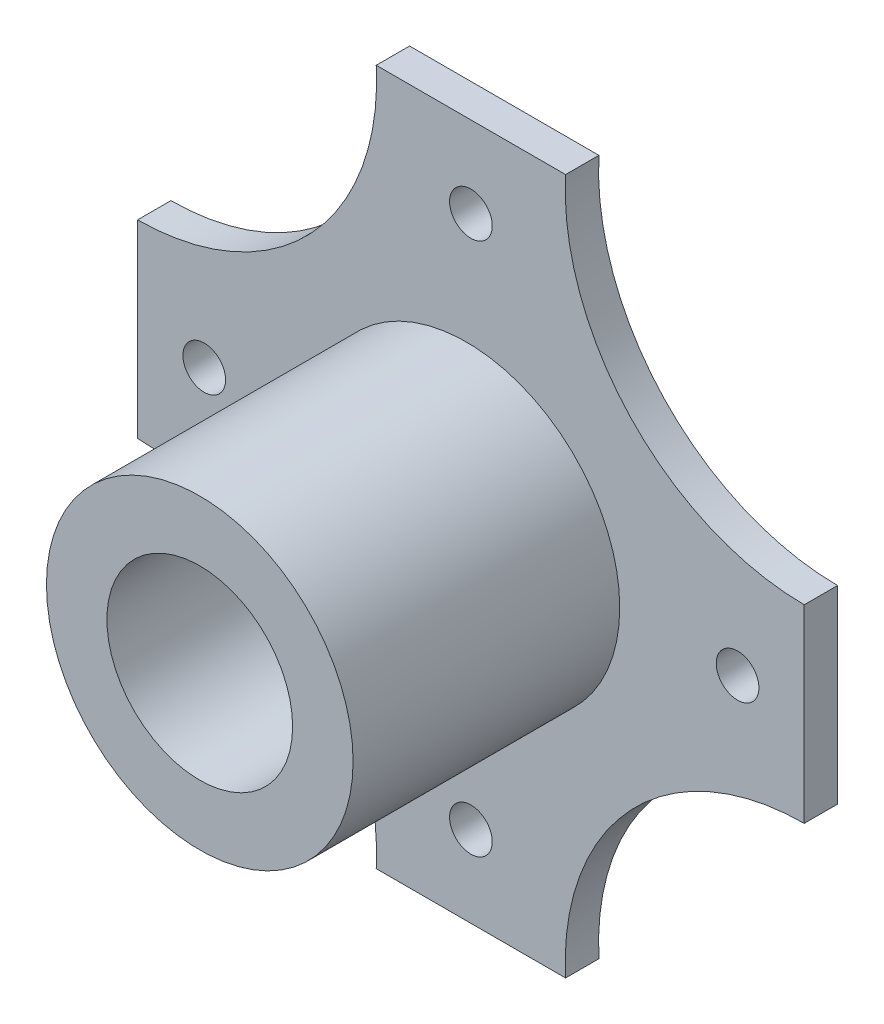
ISO-10303-21;
HEADER;
FILE_DESCRIPTION(('STEP AP214'),'2;1');
FILE_NAME('part.step','',(''),(''),'','','');
FILE_SCHEMA(('AUTOMOTIVE_DESIGN { 1 0 10303 214 1 1 1 1 }'));
ENDSEC;
DATA;
#1=APPLICATION_CONTEXT('core data for automotive mechanical design processes');
#2=APPLICATION_PROTOCOL_DEFINITION('international standard','automotive_design',2000,#1);
#3=PRODUCT_CONTEXT('',#1,'mechanical');
#4=PRODUCT('Part','Part','',(#3));
#5=PRODUCT_RELATED_PRODUCT_CATEGORY('part','',(#4));
#6=PRODUCT_DEFINITION_FORMATION('','',#4);
#7=PRODUCT_DEFINITION_CONTEXT('part definition',#1,'design');
#8=PRODUCT_DEFINITION('design','',#6,#7);
#9=PRODUCT_DEFINITION_SHAPE('','',#8);
#10=(LENGTH_UNIT() NAMED_UNIT(*) SI_UNIT(.MILLI.,.METRE.));
#11=(NAMED_UNIT(*) PLANE_ANGLE_UNIT() SI_UNIT($,.RADIAN.));
#12=(NAMED_UNIT(*) SI_UNIT($,.STERADIAN.) SOLID_ANGLE_UNIT());
#13=UNCERTAINTY_MEASURE_WITH_UNIT(LENGTH_MEASURE(1.E-05),#10,'distance_accuracy_value','');
#14=(GEOMETRIC_REPRESENTATION_CONTEXT(3) GLOBAL_UNCERTAINTY_ASSIGNED_CONTEXT((#13)) GLOBAL_UNIT_ASSIGNED_CONTEXT((#10,
#11,#12)) REPRESENTATION_CONTEXT('',''));
#15=CARTESIAN_POINT('',(0.,0.,0.));
#16=DIRECTION('',(0.,0.,1.));
#17=DIRECTION('',(1.,0.,0.));
#18=AXIS2_PLACEMENT_3D('',#15,#16,#17);
#19=CARTESIAN_POINT('',(31.4151689122494,31.877,0.));
#20=DIRECTION('',(0.,0.,1.));
#21=DIRECTION('',(1.,0.,0.));
#22=AXIS2_PLACEMENT_3D('',#19,#20,#21);
#23=CYLINDRICAL_SURFACE('',#22,5.715);
#24=CARTESIAN_POINT('',(31.4151689122494,31.877,6.35));
#25=DIRECTION('',(0.,0.,-1.));
#26=DIRECTION('',(-1.,0.,0.));
#27=AXIS2_PLACEMENT_3D('',#24,#25,#26);
#28=CIRCLE('',#27,5.715);
#29=CARTESIAN_POINT('',(25.7001689122494,31.877,6.35));
#30=VERTEX_POINT('',#29);
#31=EDGE_CURVE('E181',#30,#30,#28,.F.);
#32=ORIENTED_EDGE('',*,*,#31,.T.);
#33=EDGE_LOOP('',(#32));
#34=FACE_BOUND('',#33,.T.);
#35=CARTESIAN_POINT('',(31.4151689122494,31.877,3.175));
#36=DIRECTION('',(0.,0.,-1.));
#37=DIRECTION('',(-1.,0.,0.));
#38=AXIS2_PLACEMENT_3D('',#35,#36,#37);
#39=CIRCLE('',#38,5.715);
#40=CARTESIAN_POINT('',(25.7001689122494,31.877,3.175));
#41=VERTEX_POINT('',#40);
#42=EDGE_CURVE('E43',#41,#41,#39,.F.);
#43=ORIENTED_EDGE('',*,*,#42,.F.);
#44=EDGE_LOOP('',(#43));
#45=FACE_BOUND('',#44,.T.);
#46=ADVANCED_FACE('F39',(#34,#45),#23,.F.);
#47=CARTESIAN_POINT('',(63.6846705216539,0.,3.175));
#48=DIRECTION('',(0.,0.,-1.));
#49=DIRECTION('',(-1.,0.,0.));
#50=AXIS2_PLACEMENT_3D('',#47,#48,#49);
#51=PLANE('',#50);
#52=CARTESIAN_POINT('',(31.4151689122494,31.877,3.175));
#53=DIRECTION('',(0.,0.,1.));
#54=DIRECTION('',(1.,0.,0.));
#55=AXIS2_PLACEMENT_3D('',#52,#53,#54);
#56=CIRCLE('',#55,14.605);
#57=CARTESIAN_POINT('',(46.0201689122494,31.877,3.175));
#58=VERTEX_POINT('',#57);
#59=EDGE_CURVE('E12',#58,#58,#56,.T.);
#60=ORIENTED_EDGE('',*,*,#59,.F.);
#61=EDGE_LOOP('',(#60));
#62=FACE_BOUND('',#61,.T.);
#63=CARTESIAN_POINT('',(63.6846705216539,0.,3.175));
#64=DIRECTION('',(0.,0.,-1.));
#65=DIRECTION('',(-1.,0.,0.));
#66=AXIS2_PLACEMENT_3D('',#63,#64,#65);
#67=CIRCLE('',#66,22.8600000000001);
#68=CARTESIAN_POINT('',(40.8595217505166,-1.26181756821567,3.175));
#69=VERTEX_POINT('',#68);
#70=CARTESIAN_POINT('',(63.5923326971552,22.8598135103103,3.175));
#71=VERTEX_POINT('',#70);
#72=EDGE_CURVE('E168',#69,#71,#67,.T.);
#73=ORIENTED_EDGE('',*,*,#72,.T.);
#74=DIRECTION('',(0.,1.,0.));
#75=VECTOR('',#74,1.);
#76=CARTESIAN_POINT('',(63.5923326971552,40.8941864896897,3.175));
#77=LINE('',#76,#75);
#78=CARTESIAN_POINT('',(63.5923326971552,40.8941864896896,3.175));
#79=VERTEX_POINT('',#78);
#80=EDGE_CURVE('E107',#71,#79,#77,.T.);
#81=ORIENTED_EDGE('',*,*,#80,.T.);
#82=CARTESIAN_POINT('',(63.6846705216539,63.754,3.175));
#83=DIRECTION('',(0.,0.,-1.));
#84=DIRECTION('',(-1.,0.,0.));
#85=AXIS2_PLACEMENT_3D('',#82,#83,#84);
#86=CIRCLE('',#85,22.8600000000001);
#87=CARTESIAN_POINT('',(40.8595217505166,65.0158175682157,3.175));
#88=VERTEX_POINT('',#87);
#89=EDGE_CURVE('E223',#79,#88,#86,.T.);
#90=ORIENTED_EDGE('',*,*,#89,.T.);
#91=DIRECTION('',(-1.,0.,0.));
#92=VECTOR('',#91,1.);
#93=CARTESIAN_POINT('',(22.8251487711373,65.0158175682157,3.175));
#94=LINE('',#93,#92);
#95=CARTESIAN_POINT('',(22.8251487711371,65.0158175682156,3.175));
#96=VERTEX_POINT('',#95);
#97=EDGE_CURVE('E225',#88,#96,#94,.T.);
#98=ORIENTED_EDGE('',*,*,#97,.T.);
#99=CARTESIAN_POINT('',(0.,63.7539999999999,3.175));
#100=DIRECTION('',(0.,0.,-1.));
#101=DIRECTION('',(-1.,0.,0.));
#102=AXIS2_PLACEMENT_3D('',#99,#100,#101);
#103=CIRCLE('',#102,22.86);
#104=CARTESIAN_POINT('',(0.0923378244987348,40.8941864896897,3.175));
#105=VERTEX_POINT('',#104);
#106=EDGE_CURVE('E131',#96,#105,#103,.T.);
#107=ORIENTED_EDGE('',*,*,#106,.T.);
#108=DIRECTION('',(0.,-1.,0.));
#109=VECTOR('',#108,1.);
#110=CARTESIAN_POINT('',(0.0923378244987348,22.8598135103103,3.175));
#111=LINE('',#110,#109);
#112=CARTESIAN_POINT('',(0.092337824498735,22.8598135103104,3.175));
#113=VERTEX_POINT('',#112);
#114=EDGE_CURVE('E123',#105,#113,#111,.T.);
#115=ORIENTED_EDGE('',*,*,#114,.T.);
#116=CARTESIAN_POINT('',(0.,0.,3.175));
#117=DIRECTION('',(0.,0.,-1.));
#118=DIRECTION('',(1.,0.,0.));
#119=AXIS2_PLACEMENT_3D('',#116,#117,#118);
#120=CIRCLE('',#119,22.8600000000001);
#121=CARTESIAN_POINT('',(22.8251487711373,-1.26181756821567,3.175));
#122=VERTEX_POINT('',#121);
#123=EDGE_CURVE('E128',#113,#122,#120,.T.);
#124=ORIENTED_EDGE('',*,*,#123,.T.);
#125=DIRECTION('',(1.,0.,0.));
#126=VECTOR('',#125,1.);
#127=CARTESIAN_POINT('',(40.8595217505166,-1.26181756821567,3.175));
#128=LINE('',#127,#126);
#129=EDGE_CURVE('E65',#122,#69,#128,.T.);
#130=ORIENTED_EDGE('',*,*,#129,.T.);
#131=EDGE_LOOP('',(#73,#81,#90,#98,#107,#115,#124,#130));
#132=FACE_BOUND('',#131,.T.);
#133=CARTESIAN_POINT('',(6.44233526082695,31.877,3.175));
#134=DIRECTION('',(0.,0.,1.));
#135=DIRECTION('',(1.,0.,0.));
#136=AXIS2_PLACEMENT_3D('',#133,#134,#135);
#137=CIRCLE('',#136,2.03200000000001);
#138=CARTESIAN_POINT('',(8.47433526082696,31.877,3.175));
#139=VERTEX_POINT('',#138);
#140=EDGE_CURVE('E156',#139,#139,#137,.T.);
#141=ORIENTED_EDGE('',*,*,#140,.F.);
#142=EDGE_LOOP('',(#141));
#143=FACE_BOUND('',#142,.T.);
#144=CARTESIAN_POINT('',(31.8423352608269,57.277,3.175));
#145=DIRECTION('',(0.,0.,1.));
#146=DIRECTION('',(1.,0.,0.));
#147=AXIS2_PLACEMENT_3D('',#144,#145,#146);
#148=CIRCLE('',#147,2.032);
#149=CARTESIAN_POINT('',(33.8743352608269,57.277,3.175));
#150=VERTEX_POINT('',#149);
#151=EDGE_CURVE('E211',#150,#150,#148,.T.);
#152=ORIENTED_EDGE('',*,*,#151,.F.);
#153=EDGE_LOOP('',(#152));
#154=FACE_BOUND('',#153,.T.);
#155=CARTESIAN_POINT('',(57.2423352608269,31.8769999999998,3.175));
#156=DIRECTION('',(0.,0.,1.));
#157=DIRECTION('',(1.,0.,0.));
#158=AXIS2_PLACEMENT_3D('',#155,#156,#157);
#159=CIRCLE('',#158,2.03200000000001);
#160=CARTESIAN_POINT('',(59.2743352608269,31.8769999999998,3.175));
#161=VERTEX_POINT('',#160);
#162=EDGE_CURVE('E205',#161,#161,#159,.T.);
#163=ORIENTED_EDGE('',*,*,#162,.F.);
#164=EDGE_LOOP('',(#163));
#165=FACE_BOUND('',#164,.T.);
#166=CARTESIAN_POINT('',(31.8423378244986,6.47700000000015,3.175));
#167=DIRECTION('',(0.,0.,1.));
#168=DIRECTION('',(1.,0.,0.));
#169=AXIS2_PLACEMENT_3D('',#166,#167,#168);
#170=CIRCLE('',#169,2.032);
#171=CARTESIAN_POINT('',(33.8743378244986,6.47700000000015,3.175));
#172=VERTEX_POINT('',#171);
#173=EDGE_CURVE('E199',#172,#172,#170,.T.);
#174=ORIENTED_EDGE('',*,*,#173,.F.);
#175=EDGE_LOOP('',(#174));
#176=FACE_BOUND('',#175,.T.);
#177=ADVANCED_FACE('F125',(#62,#132,#143,#154,#165,#176),#51,.F.);
#178=CARTESIAN_POINT('',(63.6846705216539,0.,0.));
#179=DIRECTION('',(0.,0.,-1.));
#180=DIRECTION('',(-1.,0.,0.));
#181=AXIS2_PLACEMENT_3D('',#178,#179,#180);
#182=PLANE('',#181);
#183=DIRECTION('',(-0.499999999999995,0.866025403784441,0.));
#184=VECTOR('',#183,1.);
#185=CARTESIAN_POINT('',(27.2358310750214,24.6381745239264,0.));
#186=LINE('',#185,#184);
#187=CARTESIAN_POINT('',(27.2358310750214,24.6381745239264,0.));
#188=VERTEX_POINT('',#187);
#189=CARTESIAN_POINT('',(23.0564932377936,31.877,0.));
#190=VERTEX_POINT('',#189);
#191=EDGE_CURVE('E56',#188,#190,#186,.T.);
#192=ORIENTED_EDGE('',*,*,#191,.F.);
#193=DIRECTION('',(-1.,0.,0.));
#194=VECTOR('',#193,1.);
#195=CARTESIAN_POINT('',(35.5945067494772,24.6381745239263,0.));
#196=LINE('',#195,#194);
#197=CARTESIAN_POINT('',(35.5945067494772,24.6381745239263,0.));
#198=VERTEX_POINT('',#197);
#199=EDGE_CURVE('E563',#198,#188,#196,.T.);
#200=ORIENTED_EDGE('',*,*,#199,.F.);
#201=DIRECTION('',(-0.500000000000007,-0.866025403784435,0.));
#202=VECTOR('',#201,1.);
#203=CARTESIAN_POINT('',(39.7738445867051,31.8769999999999,0.));
#204=LINE('',#203,#202);
#205=CARTESIAN_POINT('',(39.7738445867051,31.8769999999999,0.));
#206=VERTEX_POINT('',#205);
#207=EDGE_CURVE('E568',#206,#198,#204,.T.);
#208=ORIENTED_EDGE('',*,*,#207,.F.);
#209=DIRECTION('',(0.499999999999995,-0.866025403784442,0.));
#210=VECTOR('',#209,1.);
#211=CARTESIAN_POINT('',(35.5945067494773,39.1158254760737,0.));
#212=LINE('',#211,#210);
#213=CARTESIAN_POINT('',(35.5945067494773,39.1158254760737,0.));
#214=VERTEX_POINT('',#213);
#215=EDGE_CURVE('E584',#214,#206,#212,.T.);
#216=ORIENTED_EDGE('',*,*,#215,.F.);
#217=DIRECTION('',(1.,0.,0.));
#218=VECTOR('',#217,1.);
#219=CARTESIAN_POINT('',(27.2358310750215,39.1158254760737,0.));
#220=LINE('',#219,#218);
#221=CARTESIAN_POINT('',(27.2358310750215,39.1158254760737,0.));
#222=VERTEX_POINT('',#221);
#223=EDGE_CURVE('E587',#222,#214,#220,.T.);
#224=ORIENTED_EDGE('',*,*,#223,.F.);
#225=DIRECTION('',(0.500000000000001,0.866025403784438,0.));
#226=VECTOR('',#225,1.);
#227=CARTESIAN_POINT('',(23.0564932377936,31.877,0.));
#228=LINE('',#227,#226);
#229=EDGE_CURVE('E590',#190,#222,#228,.T.);
#230=ORIENTED_EDGE('',*,*,#229,.F.);
#231=EDGE_LOOP('',(#192,#200,#208,#216,#224,#230));
#232=FACE_BOUND('',#231,.T.);
#233=CARTESIAN_POINT('',(57.2423352608269,31.8769999999998,0.));
#234=DIRECTION('',(0.,0.,1.));
#235=DIRECTION('',(1.,0.,0.));
#236=AXIS2_PLACEMENT_3D('',#233,#234,#235);
#237=CIRCLE('',#236,2.03200000000001);
#238=CARTESIAN_POINT('',(59.2743352608269,31.8769999999998,0.));
#239=VERTEX_POINT('',#238);
#240=EDGE_CURVE('E202',#239,#239,#237,.T.);
#241=ORIENTED_EDGE('',*,*,#240,.T.);
#242=EDGE_LOOP('',(#241));
#243=FACE_BOUND('',#242,.T.);
#244=CARTESIAN_POINT('',(6.44233526082695,31.877,0.));
#245=DIRECTION('',(0.,0.,1.));
#246=DIRECTION('',(1.,0.,0.));
#247=AXIS2_PLACEMENT_3D('',#244,#245,#246);
#248=CIRCLE('',#247,2.03200000000001);
#249=CARTESIAN_POINT('',(8.47433526082696,31.877,0.));
#250=VERTEX_POINT('',#249);
#251=EDGE_CURVE('E214',#250,#250,#248,.T.);
#252=ORIENTED_EDGE('',*,*,#251,.T.);
#253=EDGE_LOOP('',(#252));
#254=FACE_BOUND('',#253,.T.);
#255=CARTESIAN_POINT('',(63.6846705216539,0.,0.));
#256=DIRECTION('',(0.,0.,-1.));
#257=DIRECTION('',(-1.,0.,0.));
#258=AXIS2_PLACEMENT_3D('',#255,#256,#257);
#259=CIRCLE('',#258,22.8600000000001);
#260=CARTESIAN_POINT('',(40.8595217505166,-1.26181756821567,0.));
#261=VERTEX_POINT('',#260);
#262=CARTESIAN_POINT('',(63.5923326971552,22.8598135103103,0.));
#263=VERTEX_POINT('',#262);
#264=EDGE_CURVE('E152',#261,#263,#259,.T.);
#265=ORIENTED_EDGE('',*,*,#264,.F.);
#266=DIRECTION('',(1.,0.,0.));
#267=VECTOR('',#266,1.);
#268=CARTESIAN_POINT('',(40.8595217505166,-1.26181756821567,0.));
#269=LINE('',#268,#267);
#270=CARTESIAN_POINT('',(22.8251487711373,-1.26181756821567,0.));
#271=VERTEX_POINT('',#270);
#272=EDGE_CURVE('E98',#271,#261,#269,.T.);
#273=ORIENTED_EDGE('',*,*,#272,.F.);
#274=CARTESIAN_POINT('',(0.,0.,0.));
#275=DIRECTION('',(0.,0.,-1.));
#276=DIRECTION('',(1.,0.,0.));
#277=AXIS2_PLACEMENT_3D('',#274,#275,#276);
#278=CIRCLE('',#277,22.8600000000001);
#279=CARTESIAN_POINT('',(0.092337824498735,22.8598135103104,0.));
#280=VERTEX_POINT('',#279);
#281=EDGE_CURVE('E165',#280,#271,#278,.T.);
#282=ORIENTED_EDGE('',*,*,#281,.F.);
#283=DIRECTION('',(0.,-1.,0.));
#284=VECTOR('',#283,1.);
#285=CARTESIAN_POINT('',(0.0923378244987348,22.8598135103103,0.));
#286=LINE('',#285,#284);
#287=CARTESIAN_POINT('',(0.0923378244987348,40.8941864896897,0.));
#288=VERTEX_POINT('',#287);
#289=EDGE_CURVE('E140',#288,#280,#286,.T.);
#290=ORIENTED_EDGE('',*,*,#289,.F.);
#291=CARTESIAN_POINT('',(0.,63.7539999999999,0.));
#292=DIRECTION('',(0.,0.,-1.));
#293=DIRECTION('',(-1.,0.,0.));
#294=AXIS2_PLACEMENT_3D('',#291,#292,#293);
#295=CIRCLE('',#294,22.86);
#296=CARTESIAN_POINT('',(22.8251487711371,65.0158175682156,0.));
#297=VERTEX_POINT('',#296);
#298=EDGE_CURVE('E162',#297,#288,#295,.T.);
#299=ORIENTED_EDGE('',*,*,#298,.F.);
#300=DIRECTION('',(-1.,0.,0.));
#301=VECTOR('',#300,1.);
#302=CARTESIAN_POINT('',(22.8251487711373,65.0158175682157,0.));
#303=LINE('',#302,#301);
#304=CARTESIAN_POINT('',(40.8595217505166,65.0158175682157,0.));
#305=VERTEX_POINT('',#304);
#306=EDGE_CURVE('E160',#305,#297,#303,.T.);
#307=ORIENTED_EDGE('',*,*,#306,.F.);
#308=CARTESIAN_POINT('',(63.6846705216539,63.754,0.));
#309=DIRECTION('',(0.,0.,-1.));
#310=DIRECTION('',(-1.,0.,0.));
#311=AXIS2_PLACEMENT_3D('',#308,#309,#310);
#312=CIRCLE('',#311,22.8600000000001);
#313=CARTESIAN_POINT('',(63.5923326971552,40.8941864896896,0.));
#314=VERTEX_POINT('',#313);
#315=EDGE_CURVE('E158',#314,#305,#312,.T.);
#316=ORIENTED_EDGE('',*,*,#315,.F.);
#317=DIRECTION('',(0.,1.,0.));
#318=VECTOR('',#317,1.);
#319=CARTESIAN_POINT('',(63.5923326971552,40.8941864896897,0.));
#320=LINE('',#319,#318);
#321=EDGE_CURVE('E155',#263,#314,#320,.T.);
#322=ORIENTED_EDGE('',*,*,#321,.F.);
#323=EDGE_LOOP('',(#265,#273,#282,#290,#299,#307,#316,#322));
#324=FACE_BOUND('',#323,.T.);
#325=CARTESIAN_POINT('',(31.8423352608269,57.277,0.));
#326=DIRECTION('',(0.,0.,1.));
#327=DIRECTION('',(1.,0.,0.));
#328=AXIS2_PLACEMENT_3D('',#325,#326,#327);
#329=CIRCLE('',#328,2.032);
#330=CARTESIAN_POINT('',(33.8743352608269,57.277,0.));
#331=VERTEX_POINT('',#330);
#332=EDGE_CURVE('E208',#331,#331,#329,.T.);
#333=ORIENTED_EDGE('',*,*,#332,.T.);
#334=EDGE_LOOP('',(#333));
#335=FACE_BOUND('',#334,.T.);
#336=CARTESIAN_POINT('',(31.8423378244986,6.47700000000015,0.));
#337=DIRECTION('',(0.,0.,1.));
#338=DIRECTION('',(1.,0.,0.));
#339=AXIS2_PLACEMENT_3D('',#336,#337,#338);
#340=CIRCLE('',#339,2.032);
#341=CARTESIAN_POINT('',(33.8743378244986,6.47700000000015,0.));
#342=VERTEX_POINT('',#341);
#343=EDGE_CURVE('E188',#342,#342,#340,.T.);
#344=ORIENTED_EDGE('',*,*,#343,.T.);
#345=EDGE_LOOP('',(#344));
#346=FACE_BOUND('',#345,.T.);
#347=ADVANCED_FACE('F238',(#232,#243,#254,#324,#335,#346),#182,.T.);
#348=CARTESIAN_POINT('',(63.6846705216539,0.,3.175));
#349=DIRECTION('',(0.,0.,-1.));
#350=DIRECTION('',(-1.,0.,0.));
#351=AXIS2_PLACEMENT_3D('',#348,#349,#350);
#352=CYLINDRICAL_SURFACE('',#351,22.8600000000001);
#353=ORIENTED_EDGE('',*,*,#264,.T.);
#354=DIRECTION('',(0.,0.,-1.));
#355=VECTOR('',#354,1.);
#356=CARTESIAN_POINT('',(63.5923326971552,22.8598135103103,3.175));
#357=LINE('',#356,#355);
#358=EDGE_CURVE('E48',#71,#263,#357,.T.);
#359=ORIENTED_EDGE('',*,*,#358,.F.);
#360=ORIENTED_EDGE('',*,*,#72,.F.);
#361=DIRECTION('',(0.,0.,-1.));
#362=VECTOR('',#361,1.);
#363=CARTESIAN_POINT('',(40.8595217505166,-1.26181756821567,3.175));
#364=LINE('',#363,#362);
#365=EDGE_CURVE('E148',#69,#261,#364,.T.);
#366=ORIENTED_EDGE('',*,*,#365,.T.);
#367=EDGE_LOOP('',(#353,#359,#360,#366));
#368=FACE_BOUND('',#367,.T.);
#369=ADVANCED_FACE('F41',(#368),#352,.F.);
#370=CARTESIAN_POINT('',(63.5923326971552,40.8941864896897,3.175));
#371=DIRECTION('',(-1.,0.,0.));
#372=DIRECTION('',(0.,0.,1.));
#373=AXIS2_PLACEMENT_3D('',#370,#371,#372);
#374=PLANE('',#373);
#375=ORIENTED_EDGE('',*,*,#321,.T.);
#376=DIRECTION('',(0.,0.,-1.));
#377=VECTOR('',#376,1.);
#378=CARTESIAN_POINT('',(63.5923326971552,40.8941864896896,3.175));
#379=LINE('',#378,#377);
#380=EDGE_CURVE('E178',#79,#314,#379,.T.);
#381=ORIENTED_EDGE('',*,*,#380,.F.);
#382=ORIENTED_EDGE('',*,*,#80,.F.);
#383=ORIENTED_EDGE('',*,*,#358,.T.);
#384=EDGE_LOOP('',(#375,#381,#382,#383));
#385=FACE_BOUND('',#384,.T.);
#386=ADVANCED_FACE('F244',(#385),#374,.F.);
#387=CARTESIAN_POINT('',(63.6846705216539,63.754,3.175));
#388=DIRECTION('',(0.,0.,-1.));
#389=DIRECTION('',(-1.,0.,0.));
#390=AXIS2_PLACEMENT_3D('',#387,#388,#389);
#391=CYLINDRICAL_SURFACE('',#390,22.8600000000001);
#392=ORIENTED_EDGE('',*,*,#315,.T.);
#393=DIRECTION('',(0.,0.,-1.));
#394=VECTOR('',#393,1.);
#395=CARTESIAN_POINT('',(40.8595217505166,65.0158175682157,3.175));
#396=LINE('',#395,#394);
#397=EDGE_CURVE('E175',#88,#305,#396,.T.);
#398=ORIENTED_EDGE('',*,*,#397,.F.);
#399=ORIENTED_EDGE('',*,*,#89,.F.);
#400=ORIENTED_EDGE('',*,*,#380,.T.);
#401=EDGE_LOOP('',(#392,#398,#399,#400));
#402=FACE_BOUND('',#401,.T.);
#403=ADVANCED_FACE('F247',(#402),#391,.F.);
#404=CARTESIAN_POINT('',(22.8251487711373,65.0158175682157,3.175));
#405=DIRECTION('',(0.,-1.,0.));
#406=DIRECTION('',(0.,0.,-1.));
#407=AXIS2_PLACEMENT_3D('',#404,#405,#406);
#408=PLANE('',#407);
#409=ORIENTED_EDGE('',*,*,#306,.T.);
#410=DIRECTION('',(0.,0.,-1.));
#411=VECTOR('',#410,1.);
#412=CARTESIAN_POINT('',(22.8251487711371,65.0158175682156,3.175));
#413=LINE('',#412,#411);
#414=EDGE_CURVE('E172',#96,#297,#413,.T.);
#415=ORIENTED_EDGE('',*,*,#414,.F.);
#416=ORIENTED_EDGE('',*,*,#97,.F.);
#417=ORIENTED_EDGE('',*,*,#397,.T.);
#418=EDGE_LOOP('',(#409,#415,#416,#417));
#419=FACE_BOUND('',#418,.T.);
#420=ADVANCED_FACE('F231',(#419),#408,.F.);
#421=CARTESIAN_POINT('',(0.,63.7539999999999,3.175));
#422=DIRECTION('',(0.,0.,-1.));
#423=DIRECTION('',(-1.,0.,0.));
#424=AXIS2_PLACEMENT_3D('',#421,#422,#423);
#425=CYLINDRICAL_SURFACE('',#424,22.86);
#426=ORIENTED_EDGE('',*,*,#298,.T.);
#427=DIRECTION('',(0.,0.,-1.));
#428=VECTOR('',#427,1.);
#429=CARTESIAN_POINT('',(0.0923378244987348,40.8941864896897,3.175));
#430=LINE('',#429,#428);
#431=EDGE_CURVE('E143',#105,#288,#430,.T.);
#432=ORIENTED_EDGE('',*,*,#431,.F.);
#433=ORIENTED_EDGE('',*,*,#106,.F.);
#434=ORIENTED_EDGE('',*,*,#414,.T.);
#435=EDGE_LOOP('',(#426,#432,#433,#434));
#436=FACE_BOUND('',#435,.T.);
#437=ADVANCED_FACE('F235',(#436),#425,.F.);
#438=CARTESIAN_POINT('',(0.0923378244987348,22.8598135103103,3.175));
#439=DIRECTION('',(1.,0.,0.));
#440=DIRECTION('',(0.,0.,-1.));
#441=AXIS2_PLACEMENT_3D('',#438,#439,#440);
#442=PLANE('',#441);
#443=ORIENTED_EDGE('',*,*,#289,.T.);
#444=DIRECTION('',(0.,0.,-1.));
#445=VECTOR('',#444,1.);
#446=CARTESIAN_POINT('',(0.092337824498735,22.8598135103104,3.175));
#447=LINE('',#446,#445);
#448=EDGE_CURVE('E137',#113,#280,#447,.T.);
#449=ORIENTED_EDGE('',*,*,#448,.F.);
#450=ORIENTED_EDGE('',*,*,#114,.F.);
#451=ORIENTED_EDGE('',*,*,#431,.T.);
#452=EDGE_LOOP('',(#443,#449,#450,#451));
#453=FACE_BOUND('',#452,.T.);
#454=ADVANCED_FACE('F138',(#453),#442,.F.);
#455=CARTESIAN_POINT('',(0.,0.,3.175));
#456=DIRECTION('',(0.,0.,-1.));
#457=DIRECTION('',(-1.,0.,0.));
#458=AXIS2_PLACEMENT_3D('',#455,#456,#457);
#459=CYLINDRICAL_SURFACE('',#458,22.8600000000001);
#460=ORIENTED_EDGE('',*,*,#281,.T.);
#461=DIRECTION('',(0.,0.,-1.));
#462=VECTOR('',#461,1.);
#463=CARTESIAN_POINT('',(22.8251487711373,-1.26181756821567,3.175));
#464=LINE('',#463,#462);
#465=EDGE_CURVE('E144',#122,#271,#464,.T.);
#466=ORIENTED_EDGE('',*,*,#465,.F.);
#467=ORIENTED_EDGE('',*,*,#123,.F.);
#468=ORIENTED_EDGE('',*,*,#448,.T.);
#469=EDGE_LOOP('',(#460,#466,#467,#468));
#470=FACE_BOUND('',#469,.T.);
#471=ADVANCED_FACE('F146',(#470),#459,.F.);
#472=CARTESIAN_POINT('',(40.8595217505166,-1.26181756821567,3.175));
#473=DIRECTION('',(0.,1.,0.));
#474=DIRECTION('',(0.,0.,1.));
#475=AXIS2_PLACEMENT_3D('',#472,#473,#474);
#476=PLANE('',#475);
#477=ORIENTED_EDGE('',*,*,#272,.T.);
#478=ORIENTED_EDGE('',*,*,#365,.F.);
#479=ORIENTED_EDGE('',*,*,#129,.F.);
#480=ORIENTED_EDGE('',*,*,#465,.T.);
#481=EDGE_LOOP('',(#477,#478,#479,#480));
#482=FACE_BOUND('',#481,.T.);
#483=ADVANCED_FACE('F240',(#482),#476,.F.);
#484=CARTESIAN_POINT('',(6.44233526082695,31.877,3.175));
#485=DIRECTION('',(0.,0.,-1.));
#486=DIRECTION('',(-1.,0.,0.));
#487=AXIS2_PLACEMENT_3D('',#484,#485,#486);
#488=CYLINDRICAL_SURFACE('',#487,2.03200000000001);
#489=ORIENTED_EDGE('',*,*,#140,.T.);
#490=EDGE_LOOP('',(#489));
#491=FACE_BOUND('',#490,.T.);
#492=ORIENTED_EDGE('',*,*,#251,.F.);
#493=EDGE_LOOP('',(#492));
#494=FACE_BOUND('',#493,.T.);
#495=ADVANCED_FACE('F279',(#491,#494),#488,.F.);
#496=CARTESIAN_POINT('',(31.8423352608269,57.277,3.175));
#497=DIRECTION('',(0.,0.,-1.));
#498=DIRECTION('',(-1.,0.,0.));
#499=AXIS2_PLACEMENT_3D('',#496,#497,#498);
#500=CYLINDRICAL_SURFACE('',#499,2.032);
#501=ORIENTED_EDGE('',*,*,#151,.T.);
#502=EDGE_LOOP('',(#501));
#503=FACE_BOUND('',#502,.T.);
#504=ORIENTED_EDGE('',*,*,#332,.F.);
#505=EDGE_LOOP('',(#504));
#506=FACE_BOUND('',#505,.T.);
#507=ADVANCED_FACE('F275',(#503,#506),#500,.F.);
#508=CARTESIAN_POINT('',(57.2423352608269,31.8769999999998,3.175));
#509=DIRECTION('',(0.,0.,-1.));
#510=DIRECTION('',(-1.,0.,0.));
#511=AXIS2_PLACEMENT_3D('',#508,#509,#510);
#512=CYLINDRICAL_SURFACE('',#511,2.03200000000001);
#513=ORIENTED_EDGE('',*,*,#162,.T.);
#514=EDGE_LOOP('',(#513));
#515=FACE_BOUND('',#514,.T.);
#516=ORIENTED_EDGE('',*,*,#240,.F.);
#517=EDGE_LOOP('',(#516));
#518=FACE_BOUND('',#517,.T.);
#519=ADVANCED_FACE('F271',(#515,#518),#512,.F.);
#520=CARTESIAN_POINT('',(31.8423378244986,6.47700000000015,3.175));
#521=DIRECTION('',(0.,0.,-1.));
#522=DIRECTION('',(-1.,0.,0.));
#523=AXIS2_PLACEMENT_3D('',#520,#521,#522);
#524=CYLINDRICAL_SURFACE('',#523,2.032);
#525=ORIENTED_EDGE('',*,*,#173,.T.);
#526=EDGE_LOOP('',(#525));
#527=FACE_BOUND('',#526,.T.);
#528=ORIENTED_EDGE('',*,*,#343,.F.);
#529=EDGE_LOOP('',(#528));
#530=FACE_BOUND('',#529,.T.);
#531=ADVANCED_FACE('F267',(#527,#530),#524,.F.);
#532=CARTESIAN_POINT('',(31.4151689122494,31.877,28.575));
#533=DIRECTION('',(0.,0.,1.));
#534=DIRECTION('',(1.,0.,0.));
#535=AXIS2_PLACEMENT_3D('',#532,#533,#534);
#536=PLANE('',#535);
#537=CARTESIAN_POINT('',(31.4151689122494,31.877,28.575));
#538=DIRECTION('',(0.,0.,1.));
#539=DIRECTION('',(1.,0.,0.));
#540=AXIS2_PLACEMENT_3D('',#537,#538,#539);
#541=CIRCLE('',#540,8.8455120531837);
#542=CARTESIAN_POINT('',(40.2606809654331,31.877,28.575));
#543=VERTEX_POINT('',#542);
#544=EDGE_CURVE('E191',#543,#543,#541,.T.);
#545=ORIENTED_EDGE('',*,*,#544,.F.);
#546=EDGE_LOOP('',(#545));
#547=FACE_BOUND('',#546,.T.);
#548=CARTESIAN_POINT('',(31.4151689122494,31.877,28.575));
#549=DIRECTION('',(0.,0.,1.));
#550=DIRECTION('',(1.,0.,0.));
#551=AXIS2_PLACEMENT_3D('',#548,#549,#550);
#552=CIRCLE('',#551,14.605);
#553=CARTESIAN_POINT('',(46.0201689122494,31.877,28.575));
#554=VERTEX_POINT('',#553);
#555=EDGE_CURVE('E183',#554,#554,#552,.T.);
#556=ORIENTED_EDGE('',*,*,#555,.T.);
#557=EDGE_LOOP('',(#556));
#558=FACE_BOUND('',#557,.T.);
#559=ADVANCED_FACE('F270',(#547,#558),#536,.T.);
#560=CARTESIAN_POINT('',(31.4151689122494,31.877,28.575));
#561=DIRECTION('',(0.,0.,-1.));
#562=DIRECTION('',(-1.,0.,0.));
#563=AXIS2_PLACEMENT_3D('',#560,#561,#562);
#564=CYLINDRICAL_SURFACE('',#563,14.605);
#565=ORIENTED_EDGE('',*,*,#555,.F.);
#566=EDGE_LOOP('',(#565));
#567=FACE_BOUND('',#566,.T.);
#568=ORIENTED_EDGE('',*,*,#59,.T.);
#569=EDGE_LOOP('',(#568));
#570=FACE_BOUND('',#569,.T.);
#571=ADVANCED_FACE('F265',(#567,#570),#564,.T.);
#572=CARTESIAN_POINT('',(63.6846705216539,0.,6.35));
#573=DIRECTION('',(0.,0.,-1.));
#574=DIRECTION('',(-1.,0.,0.));
#575=AXIS2_PLACEMENT_3D('',#572,#573,#574);
#576=PLANE('',#575);
#577=CARTESIAN_POINT('',(31.4151689122494,31.877,6.35));
#578=DIRECTION('',(0.,0.,-1.));
#579=DIRECTION('',(-1.,0.,0.));
#580=AXIS2_PLACEMENT_3D('',#577,#578,#579);
#581=CIRCLE('',#580,8.8455120531837);
#582=CARTESIAN_POINT('',(40.2606809654331,31.877,6.35));
#583=VERTEX_POINT('',#582);
#584=EDGE_CURVE('E184',#583,#583,#581,.F.);
#585=ORIENTED_EDGE('',*,*,#584,.T.);
#586=EDGE_LOOP('',(#585));
#587=FACE_BOUND('',#586,.T.);
#588=ORIENTED_EDGE('',*,*,#31,.F.);
#589=EDGE_LOOP('',(#588));
#590=FACE_BOUND('',#589,.T.);
#591=ADVANCED_FACE('F340',(#587,#590),#576,.F.);
#592=CARTESIAN_POINT('',(31.4151689122494,31.877,-25.0188862234941));
#593=DIRECTION('',(0.,0.,1.));
#594=DIRECTION('',(1.,0.,0.));
#595=AXIS2_PLACEMENT_3D('',#592,#593,#594);
#596=CYLINDRICAL_SURFACE('',#595,8.8455120531837);
#597=CARTESIAN_POINT('',(40.2606809654331,31.877,28.575));
#598=CARTESIAN_POINT('',(40.2606809654331,31.877,28.3434895833333));
#599=CARTESIAN_POINT('',(40.2606809654331,31.877,28.1119791666667));
#600=CARTESIAN_POINT('',(40.2606809654331,31.877,27.6489583333333));
#601=CARTESIAN_POINT('',(40.2606809654331,31.877,27.4174479166667));
#602=CARTESIAN_POINT('',(40.2606809654331,31.877,26.9544270833333));
#603=CARTESIAN_POINT('',(40.2606809654331,31.877,26.7229166666667));
#604=CARTESIAN_POINT('',(40.2606809654331,31.877,26.2598958333333));
#605=CARTESIAN_POINT('',(40.2606809654331,31.877,26.0283854166667));
#606=CARTESIAN_POINT('',(40.2606809654331,31.877,25.5653645833333));
#607=CARTESIAN_POINT('',(40.2606809654331,31.877,25.3338541666667));
#608=CARTESIAN_POINT('',(40.2606809654331,31.877,24.8708333333333));
#609=CARTESIAN_POINT('',(40.2606809654331,31.877,24.6393229166667));
#610=CARTESIAN_POINT('',(40.2606809654331,31.877,24.1763020833333));
#611=CARTESIAN_POINT('',(40.2606809654331,31.877,23.9447916666667));
#612=CARTESIAN_POINT('',(40.2606809654331,31.877,23.4817708333333));
#613=CARTESIAN_POINT('',(40.2606809654331,31.877,23.2502604166667));
#614=CARTESIAN_POINT('',(40.2606809654331,31.877,22.7872395833333));
#615=CARTESIAN_POINT('',(40.2606809654331,31.877,22.5557291666667));
#616=CARTESIAN_POINT('',(40.2606809654331,31.877,22.0927083333333));
#617=CARTESIAN_POINT('',(40.2606809654331,31.877,21.8611979166667));
#618=CARTESIAN_POINT('',(40.2606809654331,31.877,21.3981770833333));
#619=CARTESIAN_POINT('',(40.2606809654331,31.877,21.1666666666667));
#620=CARTESIAN_POINT('',(40.2606809654331,31.877,20.7036458333333));
#621=CARTESIAN_POINT('',(40.2606809654331,31.877,20.4721354166667));
#622=CARTESIAN_POINT('',(40.2606809654331,31.877,20.0091145833333));
#623=CARTESIAN_POINT('',(40.2606809654331,31.877,19.7776041666667));
#624=CARTESIAN_POINT('',(40.2606809654331,31.877,19.3145833333333));
#625=CARTESIAN_POINT('',(40.2606809654331,31.877,19.0830729166667));
#626=CARTESIAN_POINT('',(40.2606809654331,31.877,18.6200520833333));
#627=CARTESIAN_POINT('',(40.2606809654331,31.877,18.3885416666667));
#628=CARTESIAN_POINT('',(40.2606809654331,31.877,17.9255208333333));
#629=CARTESIAN_POINT('',(40.2606809654331,31.877,17.6940104166667));
#630=CARTESIAN_POINT('',(40.2606809654331,31.877,17.2309895833333));
#631=CARTESIAN_POINT('',(40.2606809654331,31.877,16.9994791666667));
#632=CARTESIAN_POINT('',(40.2606809654331,31.877,16.5364583333333));
#633=CARTESIAN_POINT('',(40.2606809654331,31.877,16.3049479166667));
#634=CARTESIAN_POINT('',(40.2606809654331,31.877,15.8419270833333));
#635=CARTESIAN_POINT('',(40.2606809654331,31.877,15.6104166666667));
#636=CARTESIAN_POINT('',(40.2606809654331,31.877,15.1473958333333));
#637=CARTESIAN_POINT('',(40.2606809654331,31.877,14.9158854166667));
#638=CARTESIAN_POINT('',(40.2606809654331,31.877,14.4528645833333));
#639=CARTESIAN_POINT('',(40.2606809654331,31.877,14.2213541666667));
#640=CARTESIAN_POINT('',(40.2606809654331,31.877,13.7583333333333));
#641=CARTESIAN_POINT('',(40.2606809654331,31.877,13.5268229166667));
#642=CARTESIAN_POINT('',(40.2606809654331,31.877,13.0638020833333));
#643=CARTESIAN_POINT('',(40.2606809654331,31.877,12.8322916666667));
#644=CARTESIAN_POINT('',(40.2606809654331,31.877,12.3692708333333));
#645=CARTESIAN_POINT('',(40.2606809654331,31.877,12.1377604166667));
#646=CARTESIAN_POINT('',(40.2606809654331,31.877,11.6747395833333));
#647=CARTESIAN_POINT('',(40.2606809654331,31.877,11.4432291666667));
#648=CARTESIAN_POINT('',(40.2606809654331,31.877,10.9802083333333));
#649=CARTESIAN_POINT('',(40.2606809654331,31.877,10.7486979166667));
#650=CARTESIAN_POINT('',(40.2606809654331,31.877,10.2856770833333));
#651=CARTESIAN_POINT('',(40.2606809654331,31.877,10.0541666666667));
#652=CARTESIAN_POINT('',(40.2606809654331,31.877,9.59114583333333));
#653=CARTESIAN_POINT('',(40.2606809654331,31.877,9.35963541666666));
#654=CARTESIAN_POINT('',(40.2606809654331,31.877,8.89661458333333));
#655=CARTESIAN_POINT('',(40.2606809654331,31.877,8.66510416666666));
#656=CARTESIAN_POINT('',(40.2606809654331,31.877,8.20208333333333));
#657=CARTESIAN_POINT('',(40.2606809654331,31.877,7.97057291666666));
#658=CARTESIAN_POINT('',(40.2606809654331,31.877,7.50755208333333));
#659=CARTESIAN_POINT('',(40.2606809654331,31.877,7.27604166666666));
#660=CARTESIAN_POINT('',(40.2606809654331,31.877,6.81302083333333));
#661=CARTESIAN_POINT('',(40.2606809654331,31.877,6.58151041666666));
#662=CARTESIAN_POINT('',(40.2606809654331,31.877,6.35));
#663=B_SPLINE_CURVE_WITH_KNOTS('',3,(#597,#598,#599,#600,#601,#602,#603,#604,#605,#606,#607,
#608,#609,#610,#611,#612,#613,#614,#615,#616,#617,#618,#619,#620,#621,#622,#623,#624,#625,#626,
#627,#628,#629,#630,#631,#632,#633,#634,#635,#636,#637,#638,#639,#640,#641,#642,#643,#644,#645,
#646,#647,#648,#649,#650,#651,#652,#653,#654,#655,#656,#657,#658,#659,#660,#661,#662),
.UNSPECIFIED.,.F.,.F.,(4,2,2,2,2,2,2,2,2,2,2,2,2,2,2,2,2,2,2,2,2,2,2,2,2,2,2,2,2,2,2,2,4),(0.,
0.694531249999998,1.3890625,2.08359375,2.778125,3.47265625,4.1671875,4.86171875,5.55625,
6.25078125,6.94531249999999,7.63984375,8.334375,9.02890625,9.7234375,10.41796875,11.1125,
11.80703125,12.5015625,13.19609375,13.890625,14.58515625,15.2796875,15.97421875,16.66875,
17.36328125,18.0578125,18.75234375,19.446875,20.14140625,20.8359375,21.53046875,22.225),.UNSPECIFIED.);
#664=EDGE_CURVE('BSEAM346',#543,#583,#663,.T.);
#665=ORIENTED_EDGE('',*,*,#544,.T.);
#666=ORIENTED_EDGE('',*,*,#584,.F.);
#667=ORIENTED_EDGE('',*,*,#664,.T.);
#668=ORIENTED_EDGE('',*,*,#664,.F.);
#669=EDGE_LOOP('',(#665,#667,#666,#668));
#670=FACE_BOUND('',#669,.T.);
#671=ADVANCED_FACE('F346',(#670),#596,.F.);
#672=CARTESIAN_POINT('',(63.6846705216539,0.,3.175));
#673=DIRECTION('',(0.,0.,-1.));
#674=DIRECTION('',(-1.,0.,0.));
#675=AXIS2_PLACEMENT_3D('',#672,#673,#674);
#676=PLANE('',#675);
#677=DIRECTION('',(0.499999999999995,-0.866025403784441,0.));
#678=VECTOR('',#677,1.);
#679=CARTESIAN_POINT('',(27.2358310750214,24.6381745239264,3.175));
#680=LINE('',#679,#678);
#681=CARTESIAN_POINT('',(23.0564932377936,31.877,3.175));
#682=VERTEX_POINT('',#681);
#683=CARTESIAN_POINT('',(27.2358310750214,24.6381745239264,3.175));
#684=VERTEX_POINT('',#683);
#685=EDGE_CURVE('E554',#682,#684,#680,.T.);
#686=ORIENTED_EDGE('',*,*,#685,.F.);
#687=DIRECTION('',(-0.500000000000001,-0.866025403784438,0.));
#688=VECTOR('',#687,1.);
#689=CARTESIAN_POINT('',(23.0564932377936,31.877,3.175));
#690=LINE('',#689,#688);
#691=CARTESIAN_POINT('',(27.2358310750215,39.1158254760737,3.175));
#692=VERTEX_POINT('',#691);
#693=EDGE_CURVE('E544',#692,#682,#690,.T.);
#694=ORIENTED_EDGE('',*,*,#693,.F.);
#695=DIRECTION('',(-1.,0.,0.));
#696=VECTOR('',#695,1.);
#697=CARTESIAN_POINT('',(27.2358310750215,39.1158254760737,3.175));
#698=LINE('',#697,#696);
#699=CARTESIAN_POINT('',(35.5945067494773,39.1158254760737,3.175));
#700=VERTEX_POINT('',#699);
#701=EDGE_CURVE('E580',#700,#692,#698,.T.);
#702=ORIENTED_EDGE('',*,*,#701,.F.);
#703=DIRECTION('',(-0.499999999999995,0.866025403784442,0.));
#704=VECTOR('',#703,1.);
#705=CARTESIAN_POINT('',(35.5945067494773,39.1158254760737,3.175));
#706=LINE('',#705,#704);
#707=CARTESIAN_POINT('',(39.7738445867051,31.8769999999999,3.175));
#708=VERTEX_POINT('',#707);
#709=EDGE_CURVE('E597',#708,#700,#706,.T.);
#710=ORIENTED_EDGE('',*,*,#709,.F.);
#711=DIRECTION('',(0.500000000000007,0.866025403784435,0.));
#712=VECTOR('',#711,1.);
#713=CARTESIAN_POINT('',(39.7738445867051,31.8769999999999,3.175));
#714=LINE('',#713,#712);
#715=CARTESIAN_POINT('',(35.5945067494772,24.6381745239263,3.175));
#716=VERTEX_POINT('',#715);
#717=EDGE_CURVE('E594',#716,#708,#714,.T.);
#718=ORIENTED_EDGE('',*,*,#717,.F.);
#719=DIRECTION('',(1.,0.,0.));
#720=VECTOR('',#719,1.);
#721=CARTESIAN_POINT('',(35.5945067494772,24.6381745239263,3.175));
#722=LINE('',#721,#720);
#723=EDGE_CURVE('E560',#684,#716,#722,.T.);
#724=ORIENTED_EDGE('',*,*,#723,.F.);
#725=EDGE_LOOP('',(#686,#694,#702,#710,#718,#724));
#726=FACE_BOUND('',#725,.T.);
#727=ORIENTED_EDGE('',*,*,#42,.T.);
#728=EDGE_LOOP('',(#727));
#729=FACE_BOUND('',#728,.T.);
#730=ADVANCED_FACE('F353',(#726,#729),#676,.T.);
#731=CARTESIAN_POINT('',(27.2358310750214,24.6381745239264,28.464977124455));
#732=DIRECTION('',(-0.866025403784441,-0.499999999999995,0.));
#733=DIRECTION('',(0.499999999999995,-0.866025403784441,0.));
#734=AXIS2_PLACEMENT_3D('',#731,#732,#733);
#735=PLANE('',#734);
#736=ORIENTED_EDGE('',*,*,#685,.T.);
#737=DIRECTION('',(0.,0.,-1.));
#738=VECTOR('',#737,1.);
#739=CARTESIAN_POINT('',(27.2358310750214,24.6381745239264,28.464977124455));
#740=LINE('',#739,#738);
#741=EDGE_CURVE('E579',#684,#188,#740,.T.);
#742=ORIENTED_EDGE('',*,*,#741,.T.);
#743=ORIENTED_EDGE('',*,*,#191,.T.);
#744=DIRECTION('',(0.,0.,-1.));
#745=VECTOR('',#744,1.);
#746=CARTESIAN_POINT('',(23.0564932377936,31.877,28.464977124455));
#747=LINE('',#746,#745);
#748=EDGE_CURVE('E547',#682,#190,#747,.T.);
#749=ORIENTED_EDGE('',*,*,#748,.F.);
#750=EDGE_LOOP('',(#736,#742,#743,#749));
#751=FACE_BOUND('',#750,.T.);
#752=ADVANCED_FACE('F361',(#751),#735,.F.);
#753=CARTESIAN_POINT('',(35.5945067494772,24.6381745239263,28.464977124455));
#754=DIRECTION('',(0.,-1.,0.));
#755=DIRECTION('',(1.,0.,0.));
#756=AXIS2_PLACEMENT_3D('',#753,#754,#755);
#757=PLANE('',#756);
#758=ORIENTED_EDGE('',*,*,#723,.T.);
#759=DIRECTION('',(0.,0.,-1.));
#760=VECTOR('',#759,1.);
#761=CARTESIAN_POINT('',(35.5945067494772,24.6381745239263,28.464977124455));
#762=LINE('',#761,#760);
#763=EDGE_CURVE('E576',#716,#198,#762,.T.);
#764=ORIENTED_EDGE('',*,*,#763,.T.);
#765=ORIENTED_EDGE('',*,*,#199,.T.);
#766=ORIENTED_EDGE('',*,*,#741,.F.);
#767=EDGE_LOOP('',(#758,#764,#765,#766));
#768=FACE_BOUND('',#767,.T.);
#769=ADVANCED_FACE('F370',(#768),#757,.F.);
#770=CARTESIAN_POINT('',(39.7738445867051,31.8769999999999,28.464977124455));
#771=DIRECTION('',(0.866025403784435,-0.500000000000007,0.));
#772=DIRECTION('',(0.500000000000007,0.866025403784435,0.));
#773=AXIS2_PLACEMENT_3D('',#770,#771,#772);
#774=PLANE('',#773);
#775=ORIENTED_EDGE('',*,*,#717,.T.);
#776=DIRECTION('',(0.,0.,-1.));
#777=VECTOR('',#776,1.);
#778=CARTESIAN_POINT('',(39.7738445867051,31.8769999999999,28.464977124455));
#779=LINE('',#778,#777);
#780=EDGE_CURVE('E573',#708,#206,#779,.T.);
#781=ORIENTED_EDGE('',*,*,#780,.T.);
#782=ORIENTED_EDGE('',*,*,#207,.T.);
#783=ORIENTED_EDGE('',*,*,#763,.F.);
#784=EDGE_LOOP('',(#775,#781,#782,#783));
#785=FACE_BOUND('',#784,.T.);
#786=ADVANCED_FACE('F377',(#785),#774,.F.);
#787=CARTESIAN_POINT('',(35.5945067494773,39.1158254760737,28.464977124455));
#788=DIRECTION('',(0.866025403784442,0.499999999999995,0.));
#789=DIRECTION('',(-0.499999999999995,0.866025403784442,0.));
#790=AXIS2_PLACEMENT_3D('',#787,#788,#789);
#791=PLANE('',#790);
#792=ORIENTED_EDGE('',*,*,#709,.T.);
#793=DIRECTION('',(0.,0.,-1.));
#794=VECTOR('',#793,1.);
#795=CARTESIAN_POINT('',(35.5945067494773,39.1158254760737,28.464977124455));
#796=LINE('',#795,#794);
#797=EDGE_CURVE('E565',#700,#214,#796,.T.);
#798=ORIENTED_EDGE('',*,*,#797,.T.);
#799=ORIENTED_EDGE('',*,*,#215,.T.);
#800=ORIENTED_EDGE('',*,*,#780,.F.);
#801=EDGE_LOOP('',(#792,#798,#799,#800));
#802=FACE_BOUND('',#801,.T.);
#803=ADVANCED_FACE('F385',(#802),#791,.F.);
#804=CARTESIAN_POINT('',(27.2358310750215,39.1158254760737,28.464977124455));
#805=DIRECTION('',(0.,1.,0.));
#806=DIRECTION('',(-1.,0.,0.));
#807=AXIS2_PLACEMENT_3D('',#804,#805,#806);
#808=PLANE('',#807);
#809=ORIENTED_EDGE('',*,*,#701,.T.);
#810=DIRECTION('',(0.,0.,-1.));
#811=VECTOR('',#810,1.);
#812=CARTESIAN_POINT('',(27.2358310750215,39.1158254760737,28.464977124455));
#813=LINE('',#812,#811);
#814=EDGE_CURVE('E551',#692,#222,#813,.T.);
#815=ORIENTED_EDGE('',*,*,#814,.T.);
#816=ORIENTED_EDGE('',*,*,#223,.T.);
#817=ORIENTED_EDGE('',*,*,#797,.F.);
#818=EDGE_LOOP('',(#809,#815,#816,#817));
#819=FACE_BOUND('',#818,.T.);
#820=ADVANCED_FACE('F393',(#819),#808,.F.);
#821=CARTESIAN_POINT('',(23.0564932377936,31.877,28.464977124455));
#822=DIRECTION('',(-0.866025403784438,0.500000000000001,0.));
#823=DIRECTION('',(-0.500000000000001,-0.866025403784438,0.));
#824=AXIS2_PLACEMENT_3D('',#821,#822,#823);
#825=PLANE('',#824);
#826=ORIENTED_EDGE('',*,*,#693,.T.);
#827=ORIENTED_EDGE('',*,*,#748,.T.);
#828=ORIENTED_EDGE('',*,*,#229,.T.);
#829=ORIENTED_EDGE('',*,*,#814,.F.);
#830=EDGE_LOOP('',(#826,#827,#828,#829));
#831=FACE_BOUND('',#830,.T.);
#832=ADVANCED_FACE('F401',(#831),#825,.F.);
#833=CLOSED_SHELL('',(#46,#177,#347,#369,#386,#403,#420,#437,#454,#471,#483,#495,#507,#519,#531,
#559,#571,#591,#671,#730,#752,#769,#786,#803,#820,#832));
#834=MANIFOLD_SOLID_BREP('B2',#833);
#835=ADVANCED_BREP_SHAPE_REPRESENTATION('',(#18,#834),#14);
#836=SHAPE_DEFINITION_REPRESENTATION(#9,#835);
ENDSEC;
END-ISO-10303-21;
